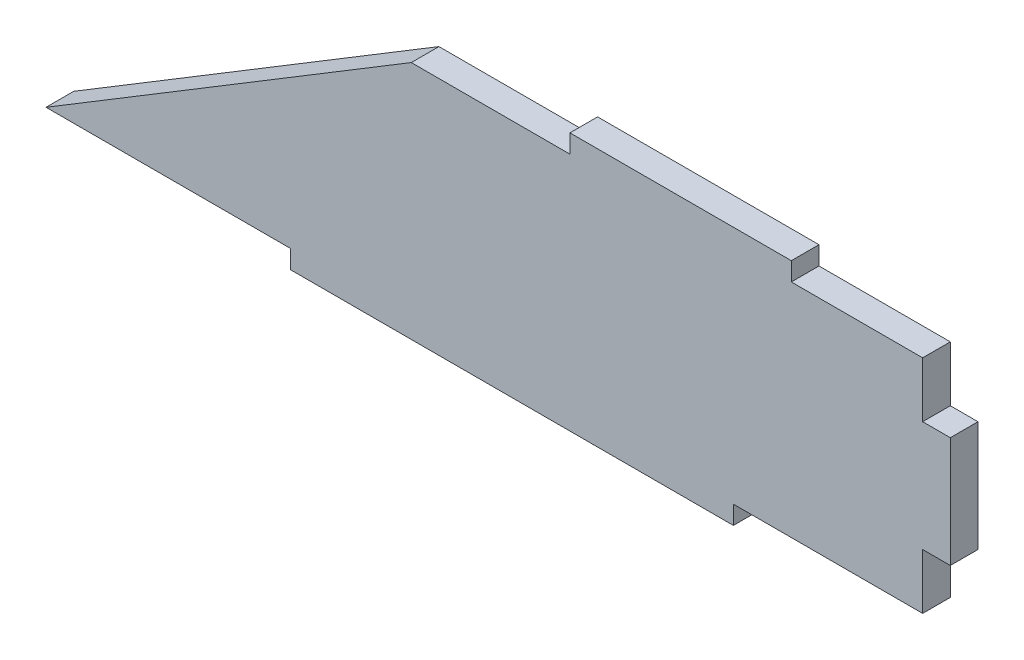
ISO-10303-21;
HEADER;
FILE_DESCRIPTION(('STEP AP214'),'2;1');
FILE_NAME('part.step','',(''),(''),'','','');
FILE_SCHEMA(('AUTOMOTIVE_DESIGN { 1 0 10303 214 1 1 1 1 }'));
ENDSEC;
DATA;
#1=APPLICATION_CONTEXT('core data for automotive mechanical design processes');
#2=APPLICATION_PROTOCOL_DEFINITION('international standard','automotive_design',2000,#1);
#3=PRODUCT_CONTEXT('',#1,'mechanical');
#4=PRODUCT('Part','Part','',(#3));
#5=PRODUCT_RELATED_PRODUCT_CATEGORY('part','',(#4));
#6=PRODUCT_DEFINITION_FORMATION('','',#4);
#7=PRODUCT_DEFINITION_CONTEXT('part definition',#1,'design');
#8=PRODUCT_DEFINITION('design','',#6,#7);
#9=PRODUCT_DEFINITION_SHAPE('','',#8);
#10=(LENGTH_UNIT() NAMED_UNIT(*) SI_UNIT(.MILLI.,.METRE.));
#11=(NAMED_UNIT(*) PLANE_ANGLE_UNIT() SI_UNIT($,.RADIAN.));
#12=(NAMED_UNIT(*) SI_UNIT($,.STERADIAN.) SOLID_ANGLE_UNIT());
#13=UNCERTAINTY_MEASURE_WITH_UNIT(LENGTH_MEASURE(1.E-05),#10,'distance_accuracy_value','');
#14=(GEOMETRIC_REPRESENTATION_CONTEXT(3) GLOBAL_UNCERTAINTY_ASSIGNED_CONTEXT((#13)) GLOBAL_UNIT_ASSIGNED_CONTEXT((#10,
#11,#12)) REPRESENTATION_CONTEXT('',''));
#15=CARTESIAN_POINT('',(0.,0.,0.));
#16=DIRECTION('',(0.,0.,1.));
#17=DIRECTION('',(1.,0.,0.));
#18=AXIS2_PLACEMENT_3D('',#15,#16,#17);
#19=CARTESIAN_POINT('',(-37.1415887647553,35.0708109179911,9.525));
#20=DIRECTION('',(0.518301716093345,-0.855197831554018,0.));
#21=DIRECTION('',(0.855197831554018,0.518301716093345,0.));
#22=AXIS2_PLACEMENT_3D('',#19,#20,#21);
#23=PLANE('',#22);
#24=DIRECTION('',(-0.855197831554018,-0.518301716093345,0.));
#25=VECTOR('',#24,1.);
#26=CARTESIAN_POINT('',(-37.1415887647553,35.0708109179911,0.));
#27=LINE('',#26,#25);
#28=CARTESIAN_POINT('',(-37.1415887647553,35.0708109179911,0.));
#29=VERTEX_POINT('',#28);
#30=CARTESIAN_POINT('',(-162.871588764755,-41.129189082009,0.));
#31=VERTEX_POINT('',#30);
#32=EDGE_CURVE('E175',#29,#31,#27,.T.);
#33=ORIENTED_EDGE('',*,*,#32,.T.);
#34=DIRECTION('',(0.,0.,-1.));
#35=VECTOR('',#34,1.);
#36=CARTESIAN_POINT('',(-162.871588764755,-41.129189082009,9.525));
#37=LINE('',#36,#35);
#38=CARTESIAN_POINT('',(-162.871588764755,-41.129189082009,9.525));
#39=VERTEX_POINT('',#38);
#40=EDGE_CURVE('E11',#39,#31,#37,.T.);
#41=ORIENTED_EDGE('',*,*,#40,.F.);
#42=DIRECTION('',(-0.855197831554018,-0.518301716093345,0.));
#43=VECTOR('',#42,1.);
#44=CARTESIAN_POINT('',(-37.1415887647553,35.0708109179911,9.525));
#45=LINE('',#44,#43);
#46=CARTESIAN_POINT('',(-37.1415887647553,35.0708109179911,9.525));
#47=VERTEX_POINT('',#46);
#48=EDGE_CURVE('E212',#47,#39,#45,.T.);
#49=ORIENTED_EDGE('',*,*,#48,.F.);
#50=DIRECTION('',(0.,0.,-1.));
#51=VECTOR('',#50,1.);
#52=CARTESIAN_POINT('',(-37.1415887647553,35.0708109179911,9.525));
#53=LINE('',#52,#51);
#54=EDGE_CURVE('E171',#47,#29,#53,.T.);
#55=ORIENTED_EDGE('',*,*,#54,.T.);
#56=EDGE_LOOP('',(#33,#41,#49,#55));
#57=FACE_BOUND('',#56,.T.);
#58=ADVANCED_FACE('F33',(#57),#23,.F.);
#59=CARTESIAN_POINT('',(-162.871588764755,-41.129189082009,9.525));
#60=DIRECTION('',(0.,1.,0.));
#61=DIRECTION('',(-1.,0.,0.));
#62=AXIS2_PLACEMENT_3D('',#59,#60,#61);
#63=PLANE('',#62);
#64=DIRECTION('',(1.,0.,0.));
#65=VECTOR('',#64,1.);
#66=CARTESIAN_POINT('',(-162.871588764755,-41.129189082009,0.));
#67=LINE('',#66,#65);
#68=CARTESIAN_POINT('',(-78.6705887647553,-41.1291890820089,0.));
#69=VERTEX_POINT('',#68);
#70=EDGE_CURVE('E178',#31,#69,#67,.T.);
#71=ORIENTED_EDGE('',*,*,#70,.T.);
#72=DIRECTION('',(0.,0.,-1.));
#73=VECTOR('',#72,1.);
#74=CARTESIAN_POINT('',(-78.6705887647553,-41.1291890820089,9.525));
#75=LINE('',#74,#73);
#76=CARTESIAN_POINT('',(-78.6705887647553,-41.1291890820089,9.525));
#77=VERTEX_POINT('',#76);
#78=EDGE_CURVE('E41',#77,#69,#75,.T.);
#79=ORIENTED_EDGE('',*,*,#78,.F.);
#80=DIRECTION('',(1.,0.,0.));
#81=VECTOR('',#80,1.);
#82=CARTESIAN_POINT('',(-162.871588764755,-41.129189082009,9.525));
#83=LINE('',#82,#81);
#84=EDGE_CURVE('E112',#39,#77,#83,.T.);
#85=ORIENTED_EDGE('',*,*,#84,.F.);
#86=ORIENTED_EDGE('',*,*,#40,.T.);
#87=EDGE_LOOP('',(#71,#79,#85,#86));
#88=FACE_BOUND('',#87,.T.);
#89=ADVANCED_FACE('F303',(#88),#63,.F.);
#90=CARTESIAN_POINT('',(-78.6705887647553,-41.1291890820089,9.525));
#91=DIRECTION('',(1.,0.,0.));
#92=DIRECTION('',(0.,0.,-1.));
#93=AXIS2_PLACEMENT_3D('',#90,#91,#92);
#94=PLANE('',#93);
#95=DIRECTION('',(0.,-1.,0.));
#96=VECTOR('',#95,1.);
#97=CARTESIAN_POINT('',(-78.6705887647553,-41.1291890820089,0.));
#98=LINE('',#97,#96);
#99=CARTESIAN_POINT('',(-78.6705887647553,-47.4791890820089,0.));
#100=VERTEX_POINT('',#99);
#101=EDGE_CURVE('E180',#69,#100,#98,.T.);
#102=ORIENTED_EDGE('',*,*,#101,.T.);
#103=DIRECTION('',(0.,0.,-1.));
#104=VECTOR('',#103,1.);
#105=CARTESIAN_POINT('',(-78.6705887647553,-47.4791890820089,9.525));
#106=LINE('',#105,#104);
#107=CARTESIAN_POINT('',(-78.6705887647553,-47.4791890820089,9.525));
#108=VERTEX_POINT('',#107);
#109=EDGE_CURVE('E238',#108,#100,#106,.T.);
#110=ORIENTED_EDGE('',*,*,#109,.F.);
#111=DIRECTION('',(0.,-1.,0.));
#112=VECTOR('',#111,1.);
#113=CARTESIAN_POINT('',(-78.6705887647553,-41.1291890820089,9.525));
#114=LINE('',#113,#112);
#115=EDGE_CURVE('E246',#77,#108,#114,.T.);
#116=ORIENTED_EDGE('',*,*,#115,.F.);
#117=ORIENTED_EDGE('',*,*,#78,.T.);
#118=EDGE_LOOP('',(#102,#110,#116,#117));
#119=FACE_BOUND('',#118,.T.);
#120=ADVANCED_FACE('F244',(#119),#94,.F.);
#121=CARTESIAN_POINT('',(-78.6705887647553,-47.4791890820089,9.525));
#122=DIRECTION('',(0.,1.,0.));
#123=DIRECTION('',(-1.,0.,0.));
#124=AXIS2_PLACEMENT_3D('',#121,#122,#123);
#125=PLANE('',#124);
#126=DIRECTION('',(1.,0.,0.));
#127=VECTOR('',#126,1.);
#128=CARTESIAN_POINT('',(-78.6705887647553,-47.4791890820089,0.));
#129=LINE('',#128,#127);
#130=CARTESIAN_POINT('',(73.7294112352447,-47.4791890820089,0.));
#131=VERTEX_POINT('',#130);
#132=EDGE_CURVE('E182',#100,#131,#129,.T.);
#133=ORIENTED_EDGE('',*,*,#132,.T.);
#134=DIRECTION('',(0.,0.,-1.));
#135=VECTOR('',#134,1.);
#136=CARTESIAN_POINT('',(73.7294112352447,-47.4791890820089,9.525));
#137=LINE('',#136,#135);
#138=CARTESIAN_POINT('',(73.7294112352447,-47.4791890820089,9.525));
#139=VERTEX_POINT('',#138);
#140=EDGE_CURVE('E235',#139,#131,#137,.T.);
#141=ORIENTED_EDGE('',*,*,#140,.F.);
#142=DIRECTION('',(1.,0.,0.));
#143=VECTOR('',#142,1.);
#144=CARTESIAN_POINT('',(-78.6705887647553,-47.4791890820089,9.525));
#145=LINE('',#144,#143);
#146=EDGE_CURVE('E264',#108,#139,#145,.T.);
#147=ORIENTED_EDGE('',*,*,#146,.F.);
#148=ORIENTED_EDGE('',*,*,#109,.T.);
#149=EDGE_LOOP('',(#133,#141,#147,#148));
#150=FACE_BOUND('',#149,.T.);
#151=ADVANCED_FACE('F255',(#150),#125,.F.);
#152=CARTESIAN_POINT('',(73.7294112352447,-47.4791890820089,9.525));
#153=DIRECTION('',(-1.,0.,0.));
#154=DIRECTION('',(0.,-1.,0.));
#155=AXIS2_PLACEMENT_3D('',#152,#153,#154);
#156=PLANE('',#155);
#157=DIRECTION('',(0.,1.,0.));
#158=VECTOR('',#157,1.);
#159=CARTESIAN_POINT('',(73.7294112352447,-47.4791890820089,0.));
#160=LINE('',#159,#158);
#161=CARTESIAN_POINT('',(73.7294112352447,-41.1291890820089,0.));
#162=VERTEX_POINT('',#161);
#163=EDGE_CURVE('E184',#131,#162,#160,.T.);
#164=ORIENTED_EDGE('',*,*,#163,.T.);
#165=DIRECTION('',(0.,0.,-1.));
#166=VECTOR('',#165,1.);
#167=CARTESIAN_POINT('',(73.7294112352447,-41.1291890820089,9.525));
#168=LINE('',#167,#166);
#169=CARTESIAN_POINT('',(73.7294112352447,-41.1291890820089,9.525));
#170=VERTEX_POINT('',#169);
#171=EDGE_CURVE('E232',#170,#162,#168,.T.);
#172=ORIENTED_EDGE('',*,*,#171,.F.);
#173=DIRECTION('',(0.,1.,0.));
#174=VECTOR('',#173,1.);
#175=CARTESIAN_POINT('',(73.7294112352447,-47.4791890820089,9.525));
#176=LINE('',#175,#174);
#177=EDGE_CURVE('E261',#139,#170,#176,.T.);
#178=ORIENTED_EDGE('',*,*,#177,.F.);
#179=ORIENTED_EDGE('',*,*,#140,.T.);
#180=EDGE_LOOP('',(#164,#172,#178,#179));
#181=FACE_BOUND('',#180,.T.);
#182=ADVANCED_FACE('F259',(#181),#156,.F.);
#183=CARTESIAN_POINT('',(73.7294112352447,-41.1291890820089,9.525));
#184=DIRECTION('',(0.,1.,0.));
#185=DIRECTION('',(-1.,0.,0.));
#186=AXIS2_PLACEMENT_3D('',#183,#184,#185);
#187=PLANE('',#186);
#188=DIRECTION('',(1.,0.,0.));
#189=VECTOR('',#188,1.);
#190=CARTESIAN_POINT('',(73.7294112352447,-41.1291890820089,0.));
#191=LINE('',#190,#189);
#192=CARTESIAN_POINT('',(138.880411235245,-41.1291890820089,0.));
#193=VERTEX_POINT('',#192);
#194=EDGE_CURVE('E186',#162,#193,#191,.T.);
#195=ORIENTED_EDGE('',*,*,#194,.T.);
#196=DIRECTION('',(0.,0.,-1.));
#197=VECTOR('',#196,1.);
#198=CARTESIAN_POINT('',(138.880411235245,-41.1291890820089,9.525));
#199=LINE('',#198,#197);
#200=CARTESIAN_POINT('',(138.880411235245,-41.1291890820089,9.525));
#201=VERTEX_POINT('',#200);
#202=EDGE_CURVE('E229',#201,#193,#199,.T.);
#203=ORIENTED_EDGE('',*,*,#202,.F.);
#204=DIRECTION('',(1.,0.,0.));
#205=VECTOR('',#204,1.);
#206=CARTESIAN_POINT('',(73.7294112352447,-41.1291890820089,9.525));
#207=LINE('',#206,#205);
#208=EDGE_CURVE('E263',#170,#201,#207,.T.);
#209=ORIENTED_EDGE('',*,*,#208,.F.);
#210=ORIENTED_EDGE('',*,*,#171,.T.);
#211=EDGE_LOOP('',(#195,#203,#209,#210));
#212=FACE_BOUND('',#211,.T.);
#213=ADVANCED_FACE('F316',(#212),#187,.F.);
#214=CARTESIAN_POINT('',(138.880411235245,-41.1291890820089,9.525));
#215=DIRECTION('',(-1.,0.,0.));
#216=DIRECTION('',(0.,0.,1.));
#217=AXIS2_PLACEMENT_3D('',#214,#215,#216);
#218=PLANE('',#217);
#219=DIRECTION('',(0.,1.,0.));
#220=VECTOR('',#219,1.);
#221=CARTESIAN_POINT('',(138.880411235245,-41.1291890820089,0.));
#222=LINE('',#221,#220);
#223=CARTESIAN_POINT('',(138.880411235245,-22.0791890820089,0.));
#224=VERTEX_POINT('',#223);
#225=EDGE_CURVE('E188',#193,#224,#222,.T.);
#226=ORIENTED_EDGE('',*,*,#225,.T.);
#227=DIRECTION('',(0.,0.,-1.));
#228=VECTOR('',#227,1.);
#229=CARTESIAN_POINT('',(138.880411235245,-22.0791890820089,9.525));
#230=LINE('',#229,#228);
#231=CARTESIAN_POINT('',(138.880411235245,-22.0791890820089,9.525));
#232=VERTEX_POINT('',#231);
#233=EDGE_CURVE('E227',#232,#224,#230,.T.);
#234=ORIENTED_EDGE('',*,*,#233,.F.);
#235=DIRECTION('',(0.,1.,0.));
#236=VECTOR('',#235,1.);
#237=CARTESIAN_POINT('',(138.880411235245,-41.1291890820089,9.525));
#238=LINE('',#237,#236);
#239=EDGE_CURVE('E266',#201,#232,#238,.T.);
#240=ORIENTED_EDGE('',*,*,#239,.F.);
#241=ORIENTED_EDGE('',*,*,#202,.T.);
#242=EDGE_LOOP('',(#226,#234,#240,#241));
#243=FACE_BOUND('',#242,.T.);
#244=ADVANCED_FACE('F319',(#243),#218,.F.);
#245=CARTESIAN_POINT('',(148.405411235245,-22.0791890820089,9.525));
#246=DIRECTION('',(0.,-1.,0.));
#247=DIRECTION('',(1.,0.,0.));
#248=AXIS2_PLACEMENT_3D('',#245,#246,#247);
#249=PLANE('',#248);
#250=DIRECTION('',(-1.,0.,0.));
#251=VECTOR('',#250,1.);
#252=CARTESIAN_POINT('',(148.405411235245,-22.0791890820089,0.));
#253=LINE('',#252,#251);
#254=CARTESIAN_POINT('',(148.405411235245,-22.0791890820089,0.));
#255=VERTEX_POINT('',#254);
#256=EDGE_CURVE('E191',#255,#224,#253,.T.);
#257=ORIENTED_EDGE('',*,*,#256,.F.);
#258=DIRECTION('',(0.,0.,-1.));
#259=VECTOR('',#258,1.);
#260=CARTESIAN_POINT('',(148.405411235245,-22.0791890820089,9.525));
#261=LINE('',#260,#259);
#262=CARTESIAN_POINT('',(148.405411235245,-22.0791890820089,9.525));
#263=VERTEX_POINT('',#262);
#264=EDGE_CURVE('E225',#263,#255,#261,.T.);
#265=ORIENTED_EDGE('',*,*,#264,.F.);
#266=DIRECTION('',(-1.,0.,0.));
#267=VECTOR('',#266,1.);
#268=CARTESIAN_POINT('',(148.405411235245,-22.0791890820089,9.525));
#269=LINE('',#268,#267);
#270=EDGE_CURVE('E272',#263,#232,#269,.T.);
#271=ORIENTED_EDGE('',*,*,#270,.T.);
#272=ORIENTED_EDGE('',*,*,#233,.T.);
#273=EDGE_LOOP('',(#257,#265,#271,#272));
#274=FACE_BOUND('',#273,.T.);
#275=ADVANCED_FACE('F323',(#274),#249,.T.);
#276=CARTESIAN_POINT('',(148.405411235245,16.0208109179911,9.525));
#277=DIRECTION('',(1.,0.,0.));
#278=DIRECTION('',(0.,0.,-1.));
#279=AXIS2_PLACEMENT_3D('',#276,#277,#278);
#280=PLANE('',#279);
#281=DIRECTION('',(0.,-1.,0.));
#282=VECTOR('',#281,1.);
#283=CARTESIAN_POINT('',(148.405411235245,16.0208109179911,0.));
#284=LINE('',#283,#282);
#285=CARTESIAN_POINT('',(148.405411235245,16.0208109179911,0.));
#286=VERTEX_POINT('',#285);
#287=EDGE_CURVE('E194',#286,#255,#284,.T.);
#288=ORIENTED_EDGE('',*,*,#287,.F.);
#289=DIRECTION('',(0.,0.,-1.));
#290=VECTOR('',#289,1.);
#291=CARTESIAN_POINT('',(148.405411235245,16.0208109179911,9.525));
#292=LINE('',#291,#290);
#293=CARTESIAN_POINT('',(148.405411235245,16.0208109179911,9.525));
#294=VERTEX_POINT('',#293);
#295=EDGE_CURVE('E223',#294,#286,#292,.T.);
#296=ORIENTED_EDGE('',*,*,#295,.F.);
#297=DIRECTION('',(0.,-1.,0.));
#298=VECTOR('',#297,1.);
#299=CARTESIAN_POINT('',(148.405411235245,16.0208109179911,9.525));
#300=LINE('',#299,#298);
#301=EDGE_CURVE('E275',#294,#263,#300,.T.);
#302=ORIENTED_EDGE('',*,*,#301,.T.);
#303=ORIENTED_EDGE('',*,*,#264,.T.);
#304=EDGE_LOOP('',(#288,#296,#302,#303));
#305=FACE_BOUND('',#304,.T.);
#306=ADVANCED_FACE('F327',(#305),#280,.T.);
#307=CARTESIAN_POINT('',(138.880411235245,16.0208109179911,9.525));
#308=DIRECTION('',(0.,1.,0.));
#309=DIRECTION('',(0.,0.,1.));
#310=AXIS2_PLACEMENT_3D('',#307,#308,#309);
#311=PLANE('',#310);
#312=DIRECTION('',(1.,0.,0.));
#313=VECTOR('',#312,1.);
#314=CARTESIAN_POINT('',(138.880411235245,16.0208109179911,0.));
#315=LINE('',#314,#313);
#316=CARTESIAN_POINT('',(138.880411235245,16.0208109179911,0.));
#317=VERTEX_POINT('',#316);
#318=EDGE_CURVE('E197',#317,#286,#315,.T.);
#319=ORIENTED_EDGE('',*,*,#318,.F.);
#320=DIRECTION('',(0.,0.,-1.));
#321=VECTOR('',#320,1.);
#322=CARTESIAN_POINT('',(138.880411235245,16.0208109179911,9.525));
#323=LINE('',#322,#321);
#324=CARTESIAN_POINT('',(138.880411235245,16.0208109179911,9.525));
#325=VERTEX_POINT('',#324);
#326=EDGE_CURVE('E221',#325,#317,#323,.T.);
#327=ORIENTED_EDGE('',*,*,#326,.F.);
#328=DIRECTION('',(1.,0.,0.));
#329=VECTOR('',#328,1.);
#330=CARTESIAN_POINT('',(138.880411235245,16.0208109179911,9.525));
#331=LINE('',#330,#329);
#332=EDGE_CURVE('E278',#325,#294,#331,.T.);
#333=ORIENTED_EDGE('',*,*,#332,.T.);
#334=ORIENTED_EDGE('',*,*,#295,.T.);
#335=EDGE_LOOP('',(#319,#327,#333,#334));
#336=FACE_BOUND('',#335,.T.);
#337=ADVANCED_FACE('F331',(#336),#311,.T.);
#338=CARTESIAN_POINT('',(138.880411235245,16.0208109179911,9.525));
#339=DIRECTION('',(-1.,0.,0.));
#340=DIRECTION('',(0.,-1.,0.));
#341=AXIS2_PLACEMENT_3D('',#338,#339,#340);
#342=PLANE('',#341);
#343=DIRECTION('',(0.,1.,0.));
#344=VECTOR('',#343,1.);
#345=CARTESIAN_POINT('',(138.880411235245,16.0208109179911,0.));
#346=LINE('',#345,#344);
#347=CARTESIAN_POINT('',(138.880411235245,35.0708109179911,0.));
#348=VERTEX_POINT('',#347);
#349=EDGE_CURVE('E200',#317,#348,#346,.T.);
#350=ORIENTED_EDGE('',*,*,#349,.T.);
#351=DIRECTION('',(0.,0.,-1.));
#352=VECTOR('',#351,1.);
#353=CARTESIAN_POINT('',(138.880411235245,35.0708109179911,9.525));
#354=LINE('',#353,#352);
#355=CARTESIAN_POINT('',(138.880411235245,35.0708109179911,9.525));
#356=VERTEX_POINT('',#355);
#357=EDGE_CURVE('E218',#356,#348,#354,.T.);
#358=ORIENTED_EDGE('',*,*,#357,.F.);
#359=DIRECTION('',(0.,1.,0.));
#360=VECTOR('',#359,1.);
#361=CARTESIAN_POINT('',(138.880411235245,16.0208109179911,9.525));
#362=LINE('',#361,#360);
#363=EDGE_CURVE('E281',#325,#356,#362,.T.);
#364=ORIENTED_EDGE('',*,*,#363,.F.);
#365=ORIENTED_EDGE('',*,*,#326,.T.);
#366=EDGE_LOOP('',(#350,#358,#364,#365));
#367=FACE_BOUND('',#366,.T.);
#368=ADVANCED_FACE('F335',(#367),#342,.F.);
#369=CARTESIAN_POINT('',(138.880411235245,35.0708109179911,9.525));
#370=DIRECTION('',(0.,-1.,0.));
#371=DIRECTION('',(1.,0.,0.));
#372=AXIS2_PLACEMENT_3D('',#369,#370,#371);
#373=PLANE('',#372);
#374=DIRECTION('',(-1.,0.,0.));
#375=VECTOR('',#374,1.);
#376=CARTESIAN_POINT('',(138.880411235245,35.0708109179911,0.));
#377=LINE('',#376,#375);
#378=CARTESIAN_POINT('',(93.6684112352447,35.0708109179911,0.));
#379=VERTEX_POINT('',#378);
#380=EDGE_CURVE('E202',#348,#379,#377,.T.);
#381=ORIENTED_EDGE('',*,*,#380,.T.);
#382=DIRECTION('',(0.,0.,-1.));
#383=VECTOR('',#382,1.);
#384=CARTESIAN_POINT('',(93.6684112352447,35.0708109179911,9.525));
#385=LINE('',#384,#383);
#386=CARTESIAN_POINT('',(93.6684112352447,35.0708109179911,9.525));
#387=VERTEX_POINT('',#386);
#388=EDGE_CURVE('E216',#387,#379,#385,.T.);
#389=ORIENTED_EDGE('',*,*,#388,.F.);
#390=DIRECTION('',(-1.,0.,0.));
#391=VECTOR('',#390,1.);
#392=CARTESIAN_POINT('',(138.880411235245,35.0708109179911,9.525));
#393=LINE('',#392,#391);
#394=EDGE_CURVE('E283',#356,#387,#393,.T.);
#395=ORIENTED_EDGE('',*,*,#394,.F.);
#396=ORIENTED_EDGE('',*,*,#357,.T.);
#397=EDGE_LOOP('',(#381,#389,#395,#396));
#398=FACE_BOUND('',#397,.T.);
#399=ADVANCED_FACE('F339',(#398),#373,.F.);
#400=CARTESIAN_POINT('',(93.6684112352447,41.4208109179911,9.525));
#401=DIRECTION('',(1.,0.,0.));
#402=DIRECTION('',(0.,1.,0.));
#403=AXIS2_PLACEMENT_3D('',#400,#401,#402);
#404=PLANE('',#403);
#405=DIRECTION('',(0.,-1.,0.));
#406=VECTOR('',#405,1.);
#407=CARTESIAN_POINT('',(93.6684112352447,41.4208109179911,0.));
#408=LINE('',#407,#406);
#409=CARTESIAN_POINT('',(93.6684112352447,41.4208109179911,0.));
#410=VERTEX_POINT('',#409);
#411=EDGE_CURVE('E205',#410,#379,#408,.T.);
#412=ORIENTED_EDGE('',*,*,#411,.F.);
#413=DIRECTION('',(0.,0.,-1.));
#414=VECTOR('',#413,1.);
#415=CARTESIAN_POINT('',(93.6684112352447,41.4208109179911,9.525));
#416=LINE('',#415,#414);
#417=CARTESIAN_POINT('',(93.6684112352447,41.4208109179911,9.525));
#418=VERTEX_POINT('',#417);
#419=EDGE_CURVE('E161',#418,#410,#416,.T.);
#420=ORIENTED_EDGE('',*,*,#419,.F.);
#421=DIRECTION('',(0.,-1.,0.));
#422=VECTOR('',#421,1.);
#423=CARTESIAN_POINT('',(93.6684112352447,41.4208109179911,9.525));
#424=LINE('',#423,#422);
#425=EDGE_CURVE('E167',#418,#387,#424,.T.);
#426=ORIENTED_EDGE('',*,*,#425,.T.);
#427=ORIENTED_EDGE('',*,*,#388,.T.);
#428=EDGE_LOOP('',(#412,#420,#426,#427));
#429=FACE_BOUND('',#428,.T.);
#430=ADVANCED_FACE('F286',(#429),#404,.T.);
#431=CARTESIAN_POINT('',(17.4684112352447,41.4208109179911,9.525));
#432=DIRECTION('',(0.,1.,0.));
#433=DIRECTION('',(0.,0.,1.));
#434=AXIS2_PLACEMENT_3D('',#431,#432,#433);
#435=PLANE('',#434);
#436=DIRECTION('',(1.,0.,0.));
#437=VECTOR('',#436,1.);
#438=CARTESIAN_POINT('',(17.4684112352447,41.4208109179911,0.));
#439=LINE('',#438,#437);
#440=CARTESIAN_POINT('',(17.4684112352447,41.4208109179911,0.));
#441=VERTEX_POINT('',#440);
#442=EDGE_CURVE('E156',#441,#410,#439,.T.);
#443=ORIENTED_EDGE('',*,*,#442,.F.);
#444=DIRECTION('',(0.,0.,-1.));
#445=VECTOR('',#444,1.);
#446=CARTESIAN_POINT('',(17.4684112352447,41.4208109179911,9.525));
#447=LINE('',#446,#445);
#448=CARTESIAN_POINT('',(17.4684112352447,41.4208109179911,9.525));
#449=VERTEX_POINT('',#448);
#450=EDGE_CURVE('E151',#449,#441,#447,.T.);
#451=ORIENTED_EDGE('',*,*,#450,.F.);
#452=DIRECTION('',(1.,0.,0.));
#453=VECTOR('',#452,1.);
#454=CARTESIAN_POINT('',(17.4684112352447,41.4208109179911,9.525));
#455=LINE('',#454,#453);
#456=EDGE_CURVE('E154',#449,#418,#455,.T.);
#457=ORIENTED_EDGE('',*,*,#456,.T.);
#458=ORIENTED_EDGE('',*,*,#419,.T.);
#459=EDGE_LOOP('',(#443,#451,#457,#458));
#460=FACE_BOUND('',#459,.T.);
#461=ADVANCED_FACE('F153',(#460),#435,.T.);
#462=CARTESIAN_POINT('',(17.4684112352447,35.0708109179911,9.525));
#463=DIRECTION('',(-1.,0.,0.));
#464=DIRECTION('',(0.,0.,1.));
#465=AXIS2_PLACEMENT_3D('',#462,#463,#464);
#466=PLANE('',#465);
#467=DIRECTION('',(0.,1.,0.));
#468=VECTOR('',#467,1.);
#469=CARTESIAN_POINT('',(17.4684112352447,35.0708109179911,0.));
#470=LINE('',#469,#468);
#471=CARTESIAN_POINT('',(17.4684112352447,35.0708109179911,0.));
#472=VERTEX_POINT('',#471);
#473=EDGE_CURVE('E209',#472,#441,#470,.T.);
#474=ORIENTED_EDGE('',*,*,#473,.F.);
#475=DIRECTION('',(0.,0.,-1.));
#476=VECTOR('',#475,1.);
#477=CARTESIAN_POINT('',(17.4684112352447,35.0708109179911,9.525));
#478=LINE('',#477,#476);
#479=CARTESIAN_POINT('',(17.4684112352447,35.0708109179911,9.525));
#480=VERTEX_POINT('',#479);
#481=EDGE_CURVE('E101',#480,#472,#478,.T.);
#482=ORIENTED_EDGE('',*,*,#481,.F.);
#483=DIRECTION('',(0.,1.,0.));
#484=VECTOR('',#483,1.);
#485=CARTESIAN_POINT('',(17.4684112352447,35.0708109179911,9.525));
#486=LINE('',#485,#484);
#487=EDGE_CURVE('E165',#480,#449,#486,.T.);
#488=ORIENTED_EDGE('',*,*,#487,.T.);
#489=ORIENTED_EDGE('',*,*,#450,.T.);
#490=EDGE_LOOP('',(#474,#482,#488,#489));
#491=FACE_BOUND('',#490,.T.);
#492=ADVANCED_FACE('F169',(#491),#466,.T.);
#493=CARTESIAN_POINT('',(17.4684112352447,35.0708109179911,9.525));
#494=DIRECTION('',(0.,-1.,0.));
#495=DIRECTION('',(1.,0.,0.));
#496=AXIS2_PLACEMENT_3D('',#493,#494,#495);
#497=PLANE('',#496);
#498=DIRECTION('',(-1.,0.,0.));
#499=VECTOR('',#498,1.);
#500=CARTESIAN_POINT('',(17.4684112352447,35.0708109179911,0.));
#501=LINE('',#500,#499);
#502=EDGE_CURVE('E104',#472,#29,#501,.T.);
#503=ORIENTED_EDGE('',*,*,#502,.T.);
#504=ORIENTED_EDGE('',*,*,#54,.F.);
#505=DIRECTION('',(-1.,0.,0.));
#506=VECTOR('',#505,1.);
#507=CARTESIAN_POINT('',(17.4684112352447,35.0708109179911,9.525));
#508=LINE('',#507,#506);
#509=EDGE_CURVE('E49',#480,#47,#508,.T.);
#510=ORIENTED_EDGE('',*,*,#509,.F.);
#511=ORIENTED_EDGE('',*,*,#481,.T.);
#512=EDGE_LOOP('',(#503,#504,#510,#511));
#513=FACE_BOUND('',#512,.T.);
#514=ADVANCED_FACE('F292',(#513),#497,.F.);
#515=CARTESIAN_POINT('',(0.,0.,9.525));
#516=DIRECTION('',(0.,0.,1.));
#517=DIRECTION('',(1.,0.,0.));
#518=AXIS2_PLACEMENT_3D('',#515,#516,#517);
#519=PLANE('',#518);
#520=ORIENTED_EDGE('',*,*,#48,.T.);
#521=ORIENTED_EDGE('',*,*,#84,.T.);
#522=ORIENTED_EDGE('',*,*,#115,.T.);
#523=ORIENTED_EDGE('',*,*,#146,.T.);
#524=ORIENTED_EDGE('',*,*,#177,.T.);
#525=ORIENTED_EDGE('',*,*,#208,.T.);
#526=ORIENTED_EDGE('',*,*,#239,.T.);
#527=ORIENTED_EDGE('',*,*,#270,.F.);
#528=ORIENTED_EDGE('',*,*,#301,.F.);
#529=ORIENTED_EDGE('',*,*,#332,.F.);
#530=ORIENTED_EDGE('',*,*,#363,.T.);
#531=ORIENTED_EDGE('',*,*,#394,.T.);
#532=ORIENTED_EDGE('',*,*,#425,.F.);
#533=ORIENTED_EDGE('',*,*,#456,.F.);
#534=ORIENTED_EDGE('',*,*,#487,.F.);
#535=ORIENTED_EDGE('',*,*,#509,.T.);
#536=EDGE_LOOP('',(#520,#521,#522,#523,#524,#525,#526,#527,#528,#529,#530,#531,#532,#533,#534,#535));
#537=FACE_BOUND('',#536,.T.);
#538=ADVANCED_FACE('F164',(#537),#519,.T.);
#539=CARTESIAN_POINT('',(0.,0.,0.));
#540=DIRECTION('',(0.,0.,1.));
#541=DIRECTION('',(1.,0.,0.));
#542=AXIS2_PLACEMENT_3D('',#539,#540,#541);
#543=PLANE('',#542);
#544=ORIENTED_EDGE('',*,*,#32,.F.);
#545=ORIENTED_EDGE('',*,*,#502,.F.);
#546=ORIENTED_EDGE('',*,*,#473,.T.);
#547=ORIENTED_EDGE('',*,*,#442,.T.);
#548=ORIENTED_EDGE('',*,*,#411,.T.);
#549=ORIENTED_EDGE('',*,*,#380,.F.);
#550=ORIENTED_EDGE('',*,*,#349,.F.);
#551=ORIENTED_EDGE('',*,*,#318,.T.);
#552=ORIENTED_EDGE('',*,*,#287,.T.);
#553=ORIENTED_EDGE('',*,*,#256,.T.);
#554=ORIENTED_EDGE('',*,*,#225,.F.);
#555=ORIENTED_EDGE('',*,*,#194,.F.);
#556=ORIENTED_EDGE('',*,*,#163,.F.);
#557=ORIENTED_EDGE('',*,*,#132,.F.);
#558=ORIENTED_EDGE('',*,*,#101,.F.);
#559=ORIENTED_EDGE('',*,*,#70,.F.);
#560=EDGE_LOOP('',(#544,#545,#546,#547,#548,#549,#550,#551,#552,#553,#554,#555,#556,#557,#558,#559));
#561=FACE_BOUND('',#560,.T.);
#562=ADVANCED_FACE('F250',(#561),#543,.F.);
#563=CLOSED_SHELL('',(#58,#89,#120,#151,#182,#213,#244,#275,#306,#337,#368,#399,#430,#461,#492,
#514,#538,#562));
#564=MANIFOLD_SOLID_BREP('B2',#563);
#565=ADVANCED_BREP_SHAPE_REPRESENTATION('',(#18,#564),#14);
#566=SHAPE_DEFINITION_REPRESENTATION(#9,#565);
ENDSEC;
END-ISO-10303-21;
